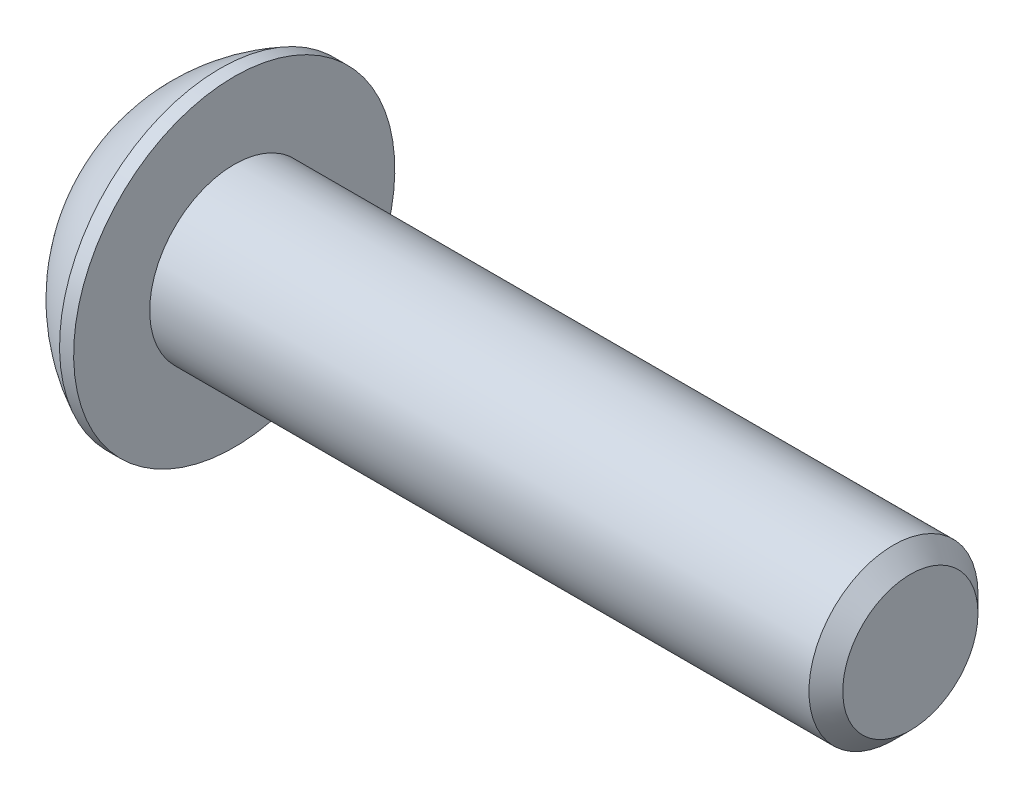
ISO-10303-21;
HEADER;
FILE_DESCRIPTION(('STEP AP214'),'2;1');
FILE_NAME('part.step','',(''),(''),'','','');
FILE_SCHEMA(('AUTOMOTIVE_DESIGN { 1 0 10303 214 1 1 1 1 }'));
ENDSEC;
DATA;
#1=APPLICATION_CONTEXT('core data for automotive mechanical design processes');
#2=APPLICATION_PROTOCOL_DEFINITION('international standard','automotive_design',2000,#1);
#3=PRODUCT_CONTEXT('',#1,'mechanical');
#4=PRODUCT('Part','Part','',(#3));
#5=PRODUCT_RELATED_PRODUCT_CATEGORY('part','',(#4));
#6=PRODUCT_DEFINITION_FORMATION('','',#4);
#7=PRODUCT_DEFINITION_CONTEXT('part definition',#1,'design');
#8=PRODUCT_DEFINITION('design','',#6,#7);
#9=PRODUCT_DEFINITION_SHAPE('','',#8);
#10=(LENGTH_UNIT() NAMED_UNIT(*) SI_UNIT(.MILLI.,.METRE.));
#11=(NAMED_UNIT(*) PLANE_ANGLE_UNIT() SI_UNIT($,.RADIAN.));
#12=(NAMED_UNIT(*) SI_UNIT($,.STERADIAN.) SOLID_ANGLE_UNIT());
#13=UNCERTAINTY_MEASURE_WITH_UNIT(LENGTH_MEASURE(1.E-05),#10,'distance_accuracy_value','');
#14=(GEOMETRIC_REPRESENTATION_CONTEXT(3) GLOBAL_UNCERTAINTY_ASSIGNED_CONTEXT((#13)) GLOBAL_UNIT_ASSIGNED_CONTEXT((#10,
#11,#12)) REPRESENTATION_CONTEXT('',''));
#15=CARTESIAN_POINT('',(0.,0.,0.));
#16=DIRECTION('',(0.,0.,1.));
#17=DIRECTION('',(1.,0.,0.));
#18=AXIS2_PLACEMENT_3D('',#15,#16,#17);
#19=CARTESIAN_POINT('',(-12.,0.,0.));
#20=DIRECTION('',(1.,0.,0.));
#21=DIRECTION('',(0.,0.,-1.));
#22=AXIS2_PLACEMENT_3D('',#19,#20,#21);
#23=CYLINDRICAL_SURFACE('',#22,1.5);
#24=CARTESIAN_POINT('',(-0.300000000000002,0.,0.));
#25=DIRECTION('',(1.,0.,0.));
#26=DIRECTION('',(0.,0.,-1.));
#27=AXIS2_PLACEMENT_3D('',#24,#25,#26);
#28=CIRCLE('',#27,1.5);
#29=CARTESIAN_POINT('',(-0.300000000000002,0.,-1.5));
#30=VERTEX_POINT('',#29);
#31=EDGE_CURVE('E45',#30,#30,#28,.F.);
#32=ORIENTED_EDGE('',*,*,#31,.T.);
#33=EDGE_LOOP('',(#32));
#34=FACE_BOUND('',#33,.T.);
#35=CARTESIAN_POINT('',(-12.,0.,0.));
#36=DIRECTION('',(1.,0.,0.));
#37=DIRECTION('',(0.,1.,0.));
#38=AXIS2_PLACEMENT_3D('',#35,#36,#37);
#39=CIRCLE('',#38,1.5);
#40=CARTESIAN_POINT('',(-12.,1.49999999999999,0.));
#41=VERTEX_POINT('',#40);
#42=EDGE_CURVE('E124',#41,#41,#39,.F.);
#43=ORIENTED_EDGE('',*,*,#42,.F.);
#44=EDGE_LOOP('',(#43));
#45=FACE_BOUND('',#44,.T.);
#46=ADVANCED_FACE('F32',(#34,#45),#23,.T.);
#47=CARTESIAN_POINT('',(0.,0.,0.));
#48=DIRECTION('',(1.,0.,0.));
#49=DIRECTION('',(0.,0.,-1.));
#50=AXIS2_PLACEMENT_3D('',#47,#48,#49);
#51=PLANE('',#50);
#52=CARTESIAN_POINT('',(0.,0.,0.));
#53=DIRECTION('',(1.,0.,0.));
#54=DIRECTION('',(0.,0.,-1.));
#55=AXIS2_PLACEMENT_3D('',#52,#53,#54);
#56=CIRCLE('',#55,1.2);
#57=CARTESIAN_POINT('',(0.,0.,-1.2));
#58=VERTEX_POINT('',#57);
#59=EDGE_CURVE('E127',#58,#58,#56,.T.);
#60=ORIENTED_EDGE('',*,*,#59,.T.);
#61=EDGE_LOOP('',(#60));
#62=FACE_BOUND('',#61,.T.);
#63=ADVANCED_FACE('F137',(#62),#51,.T.);
#64=CARTESIAN_POINT('',(0.,0.,0.));
#65=DIRECTION('',(-1.,0.,0.));
#66=DIRECTION('',(0.,0.,1.));
#67=AXIS2_PLACEMENT_3D('',#64,#65,#66);
#68=CONICAL_SURFACE('',#67,1.2,0.785398163397447);
#69=ORIENTED_EDGE('',*,*,#31,.F.);
#70=EDGE_LOOP('',(#69));
#71=FACE_BOUND('',#70,.T.);
#72=ORIENTED_EDGE('',*,*,#59,.F.);
#73=EDGE_LOOP('',(#72));
#74=FACE_BOUND('',#73,.T.);
#75=ADVANCED_FACE('F34',(#71,#74),#68,.T.);
#76=CARTESIAN_POINT('',(-13.65,0.,0.));
#77=DIRECTION('',(-1.,0.,0.));
#78=DIRECTION('',(0.,-1.,0.));
#79=AXIS2_PLACEMENT_3D('',#76,#77,#78);
#80=PLANE('',#79);
#81=CARTESIAN_POINT('',(-13.65,0.,0.));
#82=DIRECTION('',(-1.,0.,0.));
#83=DIRECTION('',(0.,-1.,0.));
#84=AXIS2_PLACEMENT_3D('',#81,#82,#83);
#85=CIRCLE('',#84,1.20470053837925);
#86=CARTESIAN_POINT('',(-13.65,-1.20470053837926,0.));
#87=VERTEX_POINT('',#86);
#88=EDGE_CURVE('E241',#87,#87,#85,.T.);
#89=ORIENTED_EDGE('',*,*,#88,.F.);
#90=EDGE_LOOP('',(#89));
#91=FACE_BOUND('',#90,.T.);
#92=CARTESIAN_POINT('',(-13.65,0.,0.));
#93=DIRECTION('',(1.,0.,0.));
#94=DIRECTION('',(0.,1.,0.));
#95=AXIS2_PLACEMENT_3D('',#92,#93,#94);
#96=CIRCLE('',#95,1.5);
#97=CARTESIAN_POINT('',(-13.65,1.5,0.));
#98=VERTEX_POINT('',#97);
#99=EDGE_CURVE('E121',#98,#98,#96,.T.);
#100=ORIENTED_EDGE('',*,*,#99,.F.);
#101=EDGE_LOOP('',(#100));
#102=FACE_BOUND('',#101,.T.);
#103=ADVANCED_FACE('F136',(#91,#102),#80,.T.);
#104=CARTESIAN_POINT('',(-10.8526785714286,0.,0.));
#105=DIRECTION('',(1.,0.,0.));
#106=DIRECTION('',(0.,1.,0.));
#107=AXIS2_PLACEMENT_3D('',#104,#105,#106);
#108=SPHERICAL_SURFACE('',#107,3.17411517981703);
#109=CARTESIAN_POINT('',(-12.25,0.,0.));
#110=DIRECTION('',(1.,0.,0.));
#111=DIRECTION('',(0.,1.,0.));
#112=AXIS2_PLACEMENT_3D('',#109,#110,#111);
#113=CIRCLE('',#112,2.85);
#114=CARTESIAN_POINT('',(-12.25,2.85,0.));
#115=VERTEX_POINT('',#114);
#116=EDGE_CURVE('E118',#115,#115,#113,.T.);
#117=CARTESIAN_POINT('',(-13.65,1.5,0.));
#118=CARTESIAN_POINT('',(-13.6402697017537,1.51814590550861,0.));
#119=CARTESIAN_POINT('',(-13.6303627914101,1.53619710575443,0.));
#120=CARTESIAN_POINT('',(-13.6101996026695,1.57210331824231,0.));
#121=CARTESIAN_POINT('',(-13.5999433242725,1.58995833048438,0.));
#122=CARTESIAN_POINT('',(-13.5790852555662,1.62546538948657,0.));
#123=CARTESIAN_POINT('',(-13.5684834652569,1.64311743624671,0.));
#124=CARTESIAN_POINT('',(-13.5469383951658,1.67821188357876,0.));
#125=CARTESIAN_POINT('',(-13.535995115384,1.69565428415069,0.));
#126=CARTESIAN_POINT('',(-13.513771208612,1.73032283245974,0.));
#127=CARTESIAN_POINT('',(-13.5024905816219,1.74754898019686,0.));
#128=CARTESIAN_POINT('',(-13.4795962529979,1.78177849951501,0.));
#129=CARTESIAN_POINT('',(-13.467982551364,1.79878187109604,0.));
#130=CARTESIAN_POINT('',(-13.4444264714719,1.8325593987641,0.));
#131=CARTESIAN_POINT('',(-13.4324840932136,1.84933355485113,0.));
#132=CARTESIAN_POINT('',(-13.4082751827463,1.88264629910089,0.));
#133=CARTESIAN_POINT('',(-13.3960086505372,1.89918488726362,0.));
#134=CARTESIAN_POINT('',(-13.3711560775515,1.93202023241769,0.));
#135=CARTESIAN_POINT('',(-13.3585700367748,1.94831698940902,0.));
#136=CARTESIAN_POINT('',(-13.3330832130497,1.98066250056315,0.));
#137=CARTESIAN_POINT('',(-13.3201824301012,1.99671125472595,0.));
#138=CARTESIAN_POINT('',(-13.2940710076189,2.02855468248374,0.));
#139=CARTESIAN_POINT('',(-13.2808603680851,2.04434935607872,0.));
#140=CARTESIAN_POINT('',(-13.254134235364,2.07567864118366,0.));
#141=CARTESIAN_POINT('',(-13.2406187421766,2.09121325269361,0.));
#142=CARTESIAN_POINT('',(-13.2132880205292,2.12201653059784,0.));
#143=CARTESIAN_POINT('',(-13.1994727920692,2.13728519699211,0.));
#144=CARTESIAN_POINT('',(-13.1715478317686,2.16755080234906,0.));
#145=CARTESIAN_POINT('',(-13.157438099928,2.18254774131173,0.));
#146=CARTESIAN_POINT('',(-13.1289294762883,2.21226421239399,0.));
#147=CARTESIAN_POINT('',(-13.1145305844891,2.22698374451358,0.));
#148=CARTESIAN_POINT('',(-13.0854490938605,2.25613982755347,0.));
#149=CARTESIAN_POINT('',(-13.0707664950309,2.27057637847377,0.));
#150=CARTESIAN_POINT('',(-13.0411231507109,2.29916103192521,0.));
#151=CARTESIAN_POINT('',(-13.0261624052204,2.31330913445635,0.));
#152=CARTESIAN_POINT('',(-12.9959684332833,2.34131153317633,0.));
#153=CARTESIAN_POINT('',(-12.9807352068367,2.35516582936518,0.));
#154=CARTESIAN_POINT('',(-12.9500020418819,2.38257536871332,0.));
#155=CARTESIAN_POINT('',(-12.9345021033738,2.3961306118726,0.));
#156=CARTESIAN_POINT('',(-12.9032413841958,2.42293691172714,0.));
#157=CARTESIAN_POINT('',(-12.887480603526,2.43618796842238,0.));
#158=CARTESIAN_POINT('',(-12.8557041687066,2.46238087711119,0.));
#159=CARTESIAN_POINT('',(-12.839688514557,2.47532272910475,0.));
#160=CARTESIAN_POINT('',(-12.8074083979817,2.50089232724988,0.));
#161=CARTESIAN_POINT('',(-12.7911439355561,2.51352007340145,0.));
#162=CARTESIAN_POINT('',(-12.7583723618573,2.53845667767541,0.));
#163=CARTESIAN_POINT('',(-12.7418652505841,2.55076553579779,0.));
#164=CARTESIAN_POINT('',(-12.7086146305115,2.57505970259155,0.));
#165=CARTESIAN_POINT('',(-12.691871121712,2.58704501126291,0.));
#166=CARTESIAN_POINT('',(-12.658154047431,2.61068754025891,0.));
#167=CARTESIAN_POINT('',(-12.6411804819494,2.62234476058354,0.));
#168=CARTESIAN_POINT('',(-12.607009722279,2.64532669825233,0.));
#169=CARTESIAN_POINT('',(-12.5898125280901,2.65665141559648,0.));
#170=CARTESIAN_POINT('',(-12.5552010236432,2.6789640585411,0.));
#171=CARTESIAN_POINT('',(-12.5377867133852,2.68995198414157,0.));
#172=CARTESIAN_POINT('',(-12.5027475717571,2.71158688256655,0.));
#173=CARTESIAN_POINT('',(-12.485122740387,2.72223385539107,0.));
#174=CARTESIAN_POINT('',(-12.449669230859,2.74318281565687,0.));
#175=CARTESIAN_POINT('',(-12.4318405527012,2.75348480309814,0.));
#176=CARTESIAN_POINT('',(-12.395986102456,2.7737398932333,0.));
#177=CARTESIAN_POINT('',(-12.3779603303685,2.78369299592719,0.));
#178=CARTESIAN_POINT('',(-12.3417185147769,2.8032465396409,0.));
#179=CARTESIAN_POINT('',(-12.3235024712727,2.81284698066071,0.));
#180=CARTESIAN_POINT('',(-12.2868870260232,2.83169159380608,0.));
#181=CARTESIAN_POINT('',(-12.268487624278,2.84093576593165,0.));
#182=CARTESIAN_POINT('',(-12.25,2.85,0.));
#183=B_SPLINE_CURVE_WITH_KNOTS('',3,(#117,#118,#119,#120,#121,#122,#123,#124,#125,#126,#127,
#128,#129,#130,#131,#132,#133,#134,#135,#136,#137,#138,#139,#140,#141,#142,#143,#144,#145,#146,
#147,#148,#149,#150,#151,#152,#153,#154,#155,#156,#157,#158,#159,#160,#161,#162,#163,#164,#165,
#166,#167,#168,#169,#170,#171,#172,#173,#174,#175,#176,#177,#178,#179,#180,#181,#182),
.UNSPECIFIED.,.F.,.F.,(4,2,2,2,2,2,2,2,2,2,2,2,2,2,2,2,2,2,2,2,2,2,2,2,2,2,2,2,2,2,2,2,4),(0.,
0.0617693508858092,0.123538701771618,0.185308052657428,0.247077403543237,0.308846754429047,
0.370616105314856,0.432385456200665,0.494154807086475,0.555924157972284,0.617693508858094,
0.679462859743903,0.741232210629711,0.803001561515521,0.864770912401331,0.92654026328714,
0.98830961417295,1.05007896505876,1.11184831594457,1.17361766683038,1.23538701771619,
1.29715636860199,1.35892571948781,1.42069507037361,1.48246442125942,1.54423377214523,
1.60600312303104,1.66777247391685,1.72954182480266,1.79131117568847,1.85308052657428,
1.91484987746009,1.9766192283459),.UNSPECIFIED.);
#184=EDGE_CURVE('BSEAM148',#98,#115,#183,.T.);
#185=ORIENTED_EDGE('',*,*,#99,.T.);
#186=ORIENTED_EDGE('',*,*,#116,.F.);
#187=ORIENTED_EDGE('',*,*,#184,.T.);
#188=ORIENTED_EDGE('',*,*,#184,.F.);
#189=EDGE_LOOP('',(#185,#187,#186,#188));
#190=FACE_BOUND('',#189,.T.);
#191=ADVANCED_FACE('F148',(#190),#108,.T.);
#192=CARTESIAN_POINT('',(-12.,0.,0.));
#193=DIRECTION('',(1.,0.,0.));
#194=DIRECTION('',(0.,1.,0.));
#195=AXIS2_PLACEMENT_3D('',#192,#193,#194);
#196=CYLINDRICAL_SURFACE('',#195,2.85);
#197=ORIENTED_EDGE('',*,*,#116,.T.);
#198=EDGE_LOOP('',(#197));
#199=FACE_BOUND('',#198,.T.);
#200=CARTESIAN_POINT('',(-12.,0.,0.));
#201=DIRECTION('',(1.,0.,0.));
#202=DIRECTION('',(0.,1.,0.));
#203=AXIS2_PLACEMENT_3D('',#200,#201,#202);
#204=CIRCLE('',#203,2.85);
#205=CARTESIAN_POINT('',(-12.,2.85,0.));
#206=VERTEX_POINT('',#205);
#207=EDGE_CURVE('E115',#206,#206,#204,.T.);
#208=ORIENTED_EDGE('',*,*,#207,.F.);
#209=EDGE_LOOP('',(#208));
#210=FACE_BOUND('',#209,.T.);
#211=ADVANCED_FACE('F152',(#199,#210),#196,.T.);
#212=CARTESIAN_POINT('',(-12.,2.85,0.));
#213=DIRECTION('',(1.,0.,0.));
#214=DIRECTION('',(0.,1.,0.));
#215=AXIS2_PLACEMENT_3D('',#212,#213,#214);
#216=PLANE('',#215);
#217=ORIENTED_EDGE('',*,*,#42,.T.);
#218=EDGE_LOOP('',(#217));
#219=FACE_BOUND('',#218,.T.);
#220=ORIENTED_EDGE('',*,*,#207,.T.);
#221=EDGE_LOOP('',(#220));
#222=FACE_BOUND('',#221,.T.);
#223=ADVANCED_FACE('F156',(#219,#222),#216,.T.);
#224=CARTESIAN_POINT('',(-13.65,0.,0.));
#225=DIRECTION('',(-1.,0.,0.));
#226=DIRECTION('',(0.,-1.,0.));
#227=AXIS2_PLACEMENT_3D('',#224,#225,#226);
#228=CONICAL_SURFACE('',#227,1.20470053837925,0.78539816339745);
#229=ORIENTED_EDGE('',*,*,#88,.T.);
#230=EDGE_LOOP('',(#229));
#231=FACE_BOUND('',#230,.T.);
#232=CARTESIAN_POINT('',(-14.0125645579163,-1.20678079288097,1.));
#233=CARTESIAN_POINT('',(-13.9901238799752,-1.17763239380938,1.));
#234=CARTESIAN_POINT('',(-13.9678867609271,-1.14832777655039,1.));
#235=CARTESIAN_POINT('',(-13.9239053230859,-1.08934073997341,1.));
#236=CARTESIAN_POINT('',(-13.902161120887,-1.05965823380996,1.));
#237=CARTESIAN_POINT('',(-13.8374858802222,-0.969511619364386,1.));
#238=CARTESIAN_POINT('',(-13.795456442765,-0.908390032886416,1.));
#239=CARTESIAN_POINT('',(-13.7124203349119,-0.77984989921404,1.));
#240=CARTESIAN_POINT('',(-13.6716484956871,-0.712278047733967,1.));
#241=CARTESIAN_POINT('',(-13.5967056855402,-0.573692441836185,1.));
#242=CARTESIAN_POINT('',(-13.5625124208036,-0.502691370033597,1.));
#243=CARTESIAN_POINT('',(-13.5206648240494,-0.396633108483675,1.));
#244=CARTESIAN_POINT('',(-13.5087524246011,-0.363265114723103,1.));
#245=CARTESIAN_POINT('',(-13.4876010580815,-0.295675144863699,1.));
#246=CARTESIAN_POINT('',(-13.4783622608543,-0.261453114661039,1.));
#247=CARTESIAN_POINT('',(-13.4632108375931,-0.192964714439433,1.));
#248=CARTESIAN_POINT('',(-13.4572372079353,-0.158712062702438,1.));
#249=CARTESIAN_POINT('',(-13.4487381792859,-0.0897678989597951,1.));
#250=CARTESIAN_POINT('',(-13.4462131691607,-0.0550763379077967,1.));
#251=CARTESIAN_POINT('',(-13.4448308242394,0.0128534343371955,1.));
#252=CARTESIAN_POINT('',(-13.4458171333425,0.0460884918414608,1.));
#253=CARTESIAN_POINT('',(-13.4510428296463,0.112288777523348,1.));
#254=CARTESIAN_POINT('',(-13.4552814228284,0.145254069576921,1.));
#255=CARTESIAN_POINT('',(-13.4668431932388,0.211252641710467,1.));
#256=CARTESIAN_POINT('',(-13.4742213991969,0.24427612610641,1.));
#257=CARTESIAN_POINT('',(-13.4916537633013,0.3095934161789,1.));
#258=CARTESIAN_POINT('',(-13.5017077720937,0.34188726247213,1.));
#259=CARTESIAN_POINT('',(-13.5364692676108,0.441188556116708,1.));
#260=CARTESIAN_POINT('',(-13.5650343603337,0.50684148084348,1.));
#261=CARTESIAN_POINT('',(-13.6286033694253,0.635081389212367,1.));
#262=CARTESIAN_POINT('',(-13.663629955309,0.697656564069526,1.));
#263=CARTESIAN_POINT('',(-13.7359546107891,0.817274369694615,1.));
#264=CARTESIAN_POINT('',(-13.7730556162911,0.874437672313584,1.));
#265=CARTESIAN_POINT('',(-13.8304371678966,0.958655710303487,1.));
#266=CARTESIAN_POINT('',(-13.8497720189249,0.986366163766953,1.));
#267=CARTESIAN_POINT('',(-13.8889602713879,1.04140691974409,1.));
#268=CARTESIAN_POINT('',(-13.908813529201,1.06873732439881,1.));
#269=CARTESIAN_POINT('',(-13.92888195229,1.0959092145887,1.));
#270=B_SPLINE_CURVE_WITH_KNOTS('',3,(#232,#233,#234,#235,#236,#237,#238,#239,#240,#241,#242,
#243,#244,#245,#246,#247,#248,#249,#250,#251,#252,#253,#254,#255,#256,#257,#258,#259,#260,#261,
#262,#263,#264,#265,#266,#267,#268,#269),.UNSPECIFIED.,.F.,.F.,(4,2,2,2,2,2,2,2,2,2,2,2,2,2,2,2,
2,2,4),(0.,0.110355487284534,0.220736811203826,0.443178348562911,0.679759335181117,
0.915523888816462,1.02172703810024,1.1279369325962,1.23208803653002,1.33625088357217,
1.43583459192535,1.53539399546241,1.63677534642524,1.73815103982916,1.95232008261278,
2.16725532249797,2.37159620059983,2.47295962852456,2.57429526618464),.UNSPECIFIED.);
#271=CARTESIAN_POINT('',(-13.6,-0.577350269189637,1.));
#272=VERTEX_POINT('',#271);
#273=CARTESIAN_POINT('',(-13.6,0.577350269189616,1.));
#274=VERTEX_POINT('',#273);
#275=EDGE_CURVE('E99',#272,#274,#270,.T.);
#276=ORIENTED_EDGE('',*,*,#275,.F.);
#277=CARTESIAN_POINT('',(-13.6001154873726,-1.1548160084331,-0.000200000000000086));
#278=CARTESIAN_POINT('',(-13.5802779308257,-1.13496520795027,0.0341825950071807));
#279=CARTESIAN_POINT('',(-13.5616050206389,-1.11478247255943,0.0691401181398248));
#280=CARTESIAN_POINT('',(-13.5274147427232,-1.0736273952922,0.140422802956089));
#281=CARTESIAN_POINT('',(-13.5119164090235,-1.05265113558081,0.176754750528984));
#282=CARTESIAN_POINT('',(-13.4853673071423,-1.01035337909804,0.250016613803311));
#283=CARTESIAN_POINT('',(-13.4742497739969,-0.989042666109251,0.286927851445414));
#284=CARTESIAN_POINT('',(-13.4571198657762,-0.945952199282702,0.361562729310858));
#285=CARTESIAN_POINT('',(-13.4510946974667,-0.924173762626608,0.399284088108635));
#286=CARTESIAN_POINT('',(-13.4456605549675,-0.886641312640026,0.464292198417932));
#287=CARTESIAN_POINT('',(-13.4448569383167,-0.870936130672287,0.491494371528171));
#288=CARTESIAN_POINT('',(-13.4462066994169,-0.83955617986286,0.545846040669111));
#289=CARTESIAN_POINT('',(-13.4483607295472,-0.823881418494935,0.572995523754874));
#290=CARTESIAN_POINT('',(-13.4591169721285,-0.777080970599378,0.654056277326959));
#291=CARTESIAN_POINT('',(-13.4720145564154,-0.746188191116442,0.707564140978426));
#292=CARTESIAN_POINT('',(-13.5031407306022,-0.691968116419661,0.80147606514343));
#293=CARTESIAN_POINT('',(-13.5197377977018,-0.668386557293383,0.842320523671833));
#294=CARTESIAN_POINT('',(-13.5571249246853,-0.622147085933693,0.922409637381943));
#295=CARTESIAN_POINT('',(-13.5779013418174,-0.599486449584586,0.961659010870437));
#296=CARTESIAN_POINT('',(-13.6001154873726,-0.577234799135799,1.0002));
#297=B_SPLINE_CURVE_WITH_KNOTS('',3,(#277,#278,#279,#280,#281,#282,#283,#284,#285,#286,#287,
#288,#289,#290,#291,#292,#293,#294,#295,#296),.UNSPECIFIED.,.F.,.F.,(4,2,2,2,2,2,2,2,2,4),(0.,
0.133237676828559,0.26725222983449,0.3991370762693,0.530689603280767,0.624814864263845,
0.718960890149131,0.907306626112096,1.05710100361789,1.20641411519286),.UNSPECIFIED.);
#298=CARTESIAN_POINT('',(-13.6,-1.15470053837926,0.));
#299=VERTEX_POINT('',#298);
#300=EDGE_CURVE('E198',#299,#272,#297,.T.);
#301=ORIENTED_EDGE('',*,*,#300,.F.);
#302=CARTESIAN_POINT('',(-13.6001154873726,-0.577234799135799,-1.0002));
#303=CARTESIAN_POINT('',(-13.5802779308257,-0.597085599618632,-0.965817404992819));
#304=CARTESIAN_POINT('',(-13.5616050206389,-0.617268335009467,-0.930859881860175));
#305=CARTESIAN_POINT('',(-13.5274147427232,-0.658423412276697,-0.85957719704391));
#306=CARTESIAN_POINT('',(-13.5119164090235,-0.679399671988091,-0.823245249471016));
#307=CARTESIAN_POINT('',(-13.4853673071423,-0.721697428470857,-0.749983386196689));
#308=CARTESIAN_POINT('',(-13.4742497739969,-0.743008141459647,-0.713072148554586));
#309=CARTESIAN_POINT('',(-13.4571198657762,-0.786098608286197,-0.638437270689141));
#310=CARTESIAN_POINT('',(-13.4510946974667,-0.807877044942291,-0.600715911891365));
#311=CARTESIAN_POINT('',(-13.4456605549675,-0.845409494928873,-0.535707801582067));
#312=CARTESIAN_POINT('',(-13.4448569383167,-0.861114676896612,-0.508505628471829));
#313=CARTESIAN_POINT('',(-13.4462066994169,-0.892494627706039,-0.454153959330889));
#314=CARTESIAN_POINT('',(-13.4483607295472,-0.908169389073964,-0.427004476245125));
#315=CARTESIAN_POINT('',(-13.4591169721285,-0.954969836969521,-0.345943722673041));
#316=CARTESIAN_POINT('',(-13.4720145564154,-0.985862616452458,-0.292435859021573));
#317=CARTESIAN_POINT('',(-13.5031407306022,-1.04008269114924,-0.198523934856569));
#318=CARTESIAN_POINT('',(-13.5197377977018,-1.06366425027552,-0.157679476328167));
#319=CARTESIAN_POINT('',(-13.5571249246853,-1.10990372163521,-0.0775903626180571));
#320=CARTESIAN_POINT('',(-13.5779013418174,-1.13256435798431,-0.0383409891295628));
#321=CARTESIAN_POINT('',(-13.6001154873726,-1.1548160084331,0.00019999999999995));
#322=B_SPLINE_CURVE_WITH_KNOTS('',3,(#302,#303,#304,#305,#306,#307,#308,#309,#310,#311,#312,
#313,#314,#315,#316,#317,#318,#319,#320,#321),.UNSPECIFIED.,.F.,.F.,(4,2,2,2,2,2,2,2,2,4),(0.,
0.133237676828559,0.26725222983449,0.3991370762693,0.530689603280767,0.624814864263845,
0.718960890149132,0.907306626112096,1.05710100361789,1.20641411519286),.UNSPECIFIED.);
#323=CARTESIAN_POINT('',(-13.6,-0.577350269189637,-1.));
#324=VERTEX_POINT('',#323);
#325=EDGE_CURVE('E193',#324,#299,#322,.T.);
#326=ORIENTED_EDGE('',*,*,#325,.F.);
#327=CARTESIAN_POINT('',(-14.0125645579163,-1.20678079288097,-1.));
#328=CARTESIAN_POINT('',(-13.9901238799752,-1.17763239380938,-1.));
#329=CARTESIAN_POINT('',(-13.9678867609271,-1.14832777655039,-1.));
#330=CARTESIAN_POINT('',(-13.9239053230859,-1.08934073997341,-1.));
#331=CARTESIAN_POINT('',(-13.902161120887,-1.05965823380996,-1.));
#332=CARTESIAN_POINT('',(-13.8374858802222,-0.969511619364386,-1.));
#333=CARTESIAN_POINT('',(-13.795456442765,-0.908390032886415,-1.));
#334=CARTESIAN_POINT('',(-13.7124203349119,-0.77984989921404,-1.));
#335=CARTESIAN_POINT('',(-13.6716484956871,-0.712278047733968,-1.));
#336=CARTESIAN_POINT('',(-13.5967056855402,-0.573692441836185,-1.));
#337=CARTESIAN_POINT('',(-13.5625124208036,-0.502691370033597,-1.));
#338=CARTESIAN_POINT('',(-13.5206648240494,-0.396633108483675,-1.));
#339=CARTESIAN_POINT('',(-13.5087524246011,-0.363265114723103,-1.));
#340=CARTESIAN_POINT('',(-13.4876010580815,-0.2956751448637,-1.));
#341=CARTESIAN_POINT('',(-13.4783622608543,-0.261453114661039,-1.));
#342=CARTESIAN_POINT('',(-13.4632108375931,-0.192964714439433,-1.));
#343=CARTESIAN_POINT('',(-13.4572372079353,-0.158712062702438,-1.));
#344=CARTESIAN_POINT('',(-13.4487381792859,-0.0897678989597955,-1.));
#345=CARTESIAN_POINT('',(-13.4462131691607,-0.0550763379077972,-1.));
#346=CARTESIAN_POINT('',(-13.4448308242394,0.012853434337195,-1.));
#347=CARTESIAN_POINT('',(-13.4458171333425,0.0460884918414604,-1.));
#348=CARTESIAN_POINT('',(-13.4510428296463,0.112288777523348,-1.));
#349=CARTESIAN_POINT('',(-13.4552814228284,0.145254069576921,-1.));
#350=CARTESIAN_POINT('',(-13.4668431932388,0.211252641710467,-1.));
#351=CARTESIAN_POINT('',(-13.4742213991969,0.244276126106411,-1.));
#352=CARTESIAN_POINT('',(-13.4916537633013,0.3095934161789,-1.));
#353=CARTESIAN_POINT('',(-13.5017077720937,0.34188726247213,-1.));
#354=CARTESIAN_POINT('',(-13.5364692676108,0.441188556116708,-1.));
#355=CARTESIAN_POINT('',(-13.5650343603337,0.50684148084348,-1.));
#356=CARTESIAN_POINT('',(-13.6286033694253,0.635081389212366,-1.));
#357=CARTESIAN_POINT('',(-13.663629955309,0.697656564069526,-1.));
#358=CARTESIAN_POINT('',(-13.7359546107891,0.817274369694615,-1.));
#359=CARTESIAN_POINT('',(-13.7730556162911,0.874437672313584,-1.));
#360=CARTESIAN_POINT('',(-13.8304371678966,0.958655710303487,-1.));
#361=CARTESIAN_POINT('',(-13.8497720189249,0.986366163766954,-1.));
#362=CARTESIAN_POINT('',(-13.8889602713879,1.04140691974409,-1.));
#363=CARTESIAN_POINT('',(-13.908813529201,1.06873732439881,-1.));
#364=CARTESIAN_POINT('',(-13.92888195229,1.0959092145887,-1.));
#365=B_SPLINE_CURVE_WITH_KNOTS('',3,(#327,#328,#329,#330,#331,#332,#333,#334,#335,#336,#337,
#338,#339,#340,#341,#342,#343,#344,#345,#346,#347,#348,#349,#350,#351,#352,#353,#354,#355,#356,
#357,#358,#359,#360,#361,#362,#363,#364),.UNSPECIFIED.,.F.,.F.,(4,2,2,2,2,2,2,2,2,2,2,2,2,2,2,2,
2,2,4),(0.,0.110355487284534,0.220736811203825,0.443178348562911,0.679759335181115,
0.915523888816463,1.02172703810024,1.1279369325962,1.23208803653002,1.33625088357217,
1.43583459192535,1.53539399546241,1.63677534642524,1.73815103982916,1.95232008261278,
2.16725532249797,2.37159620059983,2.47295962852456,2.57429526618464),.UNSPECIFIED.);
#366=CARTESIAN_POINT('',(-13.6,0.577350269189616,-1.));
#367=VERTEX_POINT('',#366);
#368=EDGE_CURVE('E52',#367,#324,#365,.F.);
#369=ORIENTED_EDGE('',*,*,#368,.F.);
#370=CARTESIAN_POINT('',(-13.6001154873726,1.15481600843308,0.000199999999999967));
#371=CARTESIAN_POINT('',(-13.5802779308257,1.13496520795025,-0.0341825950071809));
#372=CARTESIAN_POINT('',(-13.5616050206389,1.11478247255941,-0.0691401181398252));
#373=CARTESIAN_POINT('',(-13.5274147427232,1.07362739529218,-0.14042280295609));
#374=CARTESIAN_POINT('',(-13.5119164090235,1.05265113558079,-0.176754750528985));
#375=CARTESIAN_POINT('',(-13.4853673071423,1.01035337909802,-0.250016613803312));
#376=CARTESIAN_POINT('',(-13.4742497739969,0.98904266610923,-0.286927851445416));
#377=CARTESIAN_POINT('',(-13.4571198657762,0.94595219928268,-0.361562729310861));
#378=CARTESIAN_POINT('',(-13.4510946974667,0.924173762626585,-0.399284088108638));
#379=CARTESIAN_POINT('',(-13.4456605549675,0.886641312640003,-0.464292198417936));
#380=CARTESIAN_POINT('',(-13.4448569383167,0.870936130672264,-0.491494371528174));
#381=CARTESIAN_POINT('',(-13.4462066994169,0.839556179862837,-0.545846040669114));
#382=CARTESIAN_POINT('',(-13.4483607295472,0.823881418494912,-0.572995523754878));
#383=CARTESIAN_POINT('',(-13.4591169721285,0.777080970599355,-0.654056277326962));
#384=CARTESIAN_POINT('',(-13.4720145564154,0.746188191116419,-0.70756414097843));
#385=CARTESIAN_POINT('',(-13.5031407306022,0.691968116419638,-0.801476065143433));
#386=CARTESIAN_POINT('',(-13.5197377977018,0.66838655729336,-0.842320523671836));
#387=CARTESIAN_POINT('',(-13.5571249246853,0.622147085933671,-0.922409637381944));
#388=CARTESIAN_POINT('',(-13.5779013418174,0.599486449584565,-0.961659010870438));
#389=CARTESIAN_POINT('',(-13.6001154873726,0.577234799135778,-1.0002));
#390=B_SPLINE_CURVE_WITH_KNOTS('',3,(#370,#371,#372,#373,#374,#375,#376,#377,#378,#379,#380,
#381,#382,#383,#384,#385,#386,#387,#388,#389),.UNSPECIFIED.,.F.,.F.,(4,2,2,2,2,2,2,2,2,4),(0.,
0.133237676828559,0.267252229834491,0.399137076269301,0.53068960328077,0.624814864263848,
0.718960890149135,0.9073066261121,1.05710100361789,1.20641411519286),.UNSPECIFIED.);
#391=CARTESIAN_POINT('',(-13.6,1.15470053837924,0.));
#392=VERTEX_POINT('',#391);
#393=EDGE_CURVE('E11',#392,#367,#390,.T.);
#394=ORIENTED_EDGE('',*,*,#393,.F.);
#395=CARTESIAN_POINT('',(-13.6001154873726,0.577234799135778,1.0002));
#396=CARTESIAN_POINT('',(-13.5802779308257,0.597085599618611,0.965817404992819));
#397=CARTESIAN_POINT('',(-13.5616050206389,0.617268335009446,0.930859881860175));
#398=CARTESIAN_POINT('',(-13.5274147427232,0.658423412276675,0.859577197043911));
#399=CARTESIAN_POINT('',(-13.5119164090235,0.679399671988069,0.823245249471017));
#400=CARTESIAN_POINT('',(-13.4853673071423,0.721697428470835,0.74998338619669));
#401=CARTESIAN_POINT('',(-13.4742497739969,0.743008141459626,0.713072148554587));
#402=CARTESIAN_POINT('',(-13.4571198657762,0.786098608286175,0.638437270689142));
#403=CARTESIAN_POINT('',(-13.4510946974667,0.80787704494227,0.600715911891365));
#404=CARTESIAN_POINT('',(-13.4456605549675,0.845409494928852,0.535707801582068));
#405=CARTESIAN_POINT('',(-13.4448569383167,0.861114676896591,0.508505628471829));
#406=CARTESIAN_POINT('',(-13.4462066994169,0.892494627706018,0.454153959330889));
#407=CARTESIAN_POINT('',(-13.4483607295472,0.908169389073943,0.427004476245126));
#408=CARTESIAN_POINT('',(-13.4591169721285,0.9549698369695,0.345943722673041));
#409=CARTESIAN_POINT('',(-13.4720145564154,0.985862616452436,0.292435859021574));
#410=CARTESIAN_POINT('',(-13.5031407306022,1.04008269114922,0.19852393485657));
#411=CARTESIAN_POINT('',(-13.5197377977018,1.06366425027549,0.157679476328167));
#412=CARTESIAN_POINT('',(-13.5571249246853,1.10990372163519,0.0775903626180574));
#413=CARTESIAN_POINT('',(-13.5779013418174,1.13256435798429,0.0383409891295631));
#414=CARTESIAN_POINT('',(-13.6001154873726,1.15481600843308,-0.000199999999999691));
#415=B_SPLINE_CURVE_WITH_KNOTS('',3,(#395,#396,#397,#398,#399,#400,#401,#402,#403,#404,#405,
#406,#407,#408,#409,#410,#411,#412,#413,#414),.UNSPECIFIED.,.F.,.F.,(4,2,2,2,2,2,2,2,2,4),(0.,
0.133237676828558,0.267252229834489,0.399137076269298,0.530689603280766,0.624814864263844,
0.718960890149131,0.907306626112095,1.05710100361789,1.20641411519286),.UNSPECIFIED.);
#416=EDGE_CURVE('E90',#274,#392,#415,.T.);
#417=ORIENTED_EDGE('',*,*,#416,.F.);
#418=EDGE_LOOP('',(#276,#301,#326,#369,#394,#417));
#419=FACE_BOUND('',#418,.T.);
#420=ADVANCED_FACE('F89',(#231,#419),#228,.F.);
#421=CARTESIAN_POINT('',(-12.45,0.,0.));
#422=DIRECTION('',(-1.,0.,0.));
#423=DIRECTION('',(0.,0.,1.));
#424=AXIS2_PLACEMENT_3D('',#421,#422,#423);
#425=PLANE('',#424);
#426=DIRECTION('',(0.,0.5,-0.866025403784439));
#427=VECTOR('',#426,1.);
#428=CARTESIAN_POINT('',(-12.45,0.577350269189616,1.));
#429=LINE('',#428,#427);
#430=CARTESIAN_POINT('',(-12.45,0.577350269189616,1.));
#431=VERTEX_POINT('',#430);
#432=CARTESIAN_POINT('',(-12.45,1.15470053837924,0.));
#433=VERTEX_POINT('',#432);
#434=EDGE_CURVE('E98',#431,#433,#429,.T.);
#435=ORIENTED_EDGE('',*,*,#434,.T.);
#436=DIRECTION('',(0.,-0.5,-0.866025403784439));
#437=VECTOR('',#436,1.);
#438=CARTESIAN_POINT('',(-12.45,1.15470053837924,0.));
#439=LINE('',#438,#437);
#440=CARTESIAN_POINT('',(-12.45,0.577350269189615,-1.));
#441=VERTEX_POINT('',#440);
#442=EDGE_CURVE('E103',#433,#441,#439,.T.);
#443=ORIENTED_EDGE('',*,*,#442,.T.);
#444=DIRECTION('',(0.,-1.,0.));
#445=VECTOR('',#444,1.);
#446=CARTESIAN_POINT('',(-12.45,0.577350269189615,-1.));
#447=LINE('',#446,#445);
#448=CARTESIAN_POINT('',(-12.45,-0.577350269189637,-1.));
#449=VERTEX_POINT('',#448);
#450=EDGE_CURVE('E223',#441,#449,#447,.T.);
#451=ORIENTED_EDGE('',*,*,#450,.T.);
#452=DIRECTION('',(0.,-0.5,0.866025403784439));
#453=VECTOR('',#452,1.);
#454=CARTESIAN_POINT('',(-12.45,-0.577350269189637,-1.));
#455=LINE('',#454,#453);
#456=CARTESIAN_POINT('',(-12.45,-1.15470053837926,0.));
#457=VERTEX_POINT('',#456);
#458=EDGE_CURVE('E227',#449,#457,#455,.T.);
#459=ORIENTED_EDGE('',*,*,#458,.T.);
#460=DIRECTION('',(0.,0.5,0.866025403784439));
#461=VECTOR('',#460,1.);
#462=CARTESIAN_POINT('',(-12.45,-1.15470053837926,0.));
#463=LINE('',#462,#461);
#464=CARTESIAN_POINT('',(-12.45,-0.577350269189637,1.));
#465=VERTEX_POINT('',#464);
#466=EDGE_CURVE('E111',#457,#465,#463,.T.);
#467=ORIENTED_EDGE('',*,*,#466,.T.);
#468=DIRECTION('',(0.,1.,0.));
#469=VECTOR('',#468,1.);
#470=CARTESIAN_POINT('',(-12.45,-0.577350269189637,1.));
#471=LINE('',#470,#469);
#472=EDGE_CURVE('E106',#465,#431,#471,.T.);
#473=ORIENTED_EDGE('',*,*,#472,.T.);
#474=EDGE_LOOP('',(#435,#443,#451,#459,#467,#473));
#475=FACE_BOUND('',#474,.T.);
#476=ADVANCED_FACE('F180',(#475),#425,.T.);
#477=CARTESIAN_POINT('',(-12.45,1.15470053837924,0.));
#478=DIRECTION('',(0.,0.866025403784439,-0.5));
#479=DIRECTION('',(0.,0.5,0.866025403784439));
#480=AXIS2_PLACEMENT_3D('',#477,#478,#479);
#481=PLANE('',#480);
#482=DIRECTION('',(-1.,0.,0.));
#483=VECTOR('',#482,1.);
#484=CARTESIAN_POINT('',(-12.45,1.15470053837924,0.));
#485=LINE('',#484,#483);
#486=EDGE_CURVE('E96',#433,#392,#485,.T.);
#487=ORIENTED_EDGE('',*,*,#486,.T.);
#488=ORIENTED_EDGE('',*,*,#393,.T.);
#489=DIRECTION('',(-1.,0.,0.));
#490=VECTOR('',#489,1.);
#491=CARTESIAN_POINT('',(-12.45,0.577350269189615,-1.));
#492=LINE('',#491,#490);
#493=EDGE_CURVE('E105',#441,#367,#492,.T.);
#494=ORIENTED_EDGE('',*,*,#493,.F.);
#495=ORIENTED_EDGE('',*,*,#442,.F.);
#496=EDGE_LOOP('',(#487,#488,#494,#495));
#497=FACE_BOUND('',#496,.T.);
#498=ADVANCED_FACE('F101',(#497),#481,.F.);
#499=CARTESIAN_POINT('',(-12.45,0.577350269189615,-1.));
#500=DIRECTION('',(0.,0.,-1.));
#501=DIRECTION('',(-1.,0.,0.));
#502=AXIS2_PLACEMENT_3D('',#499,#500,#501);
#503=PLANE('',#502);
#504=ORIENTED_EDGE('',*,*,#493,.T.);
#505=ORIENTED_EDGE('',*,*,#368,.T.);
#506=DIRECTION('',(-1.,0.,0.));
#507=VECTOR('',#506,1.);
#508=CARTESIAN_POINT('',(-12.45,-0.577350269189637,-1.));
#509=LINE('',#508,#507);
#510=EDGE_CURVE('E108',#449,#324,#509,.T.);
#511=ORIENTED_EDGE('',*,*,#510,.F.);
#512=ORIENTED_EDGE('',*,*,#450,.F.);
#513=EDGE_LOOP('',(#504,#505,#511,#512));
#514=FACE_BOUND('',#513,.T.);
#515=ADVANCED_FACE('F212',(#514),#503,.F.);
#516=CARTESIAN_POINT('',(-12.45,-0.577350269189637,-1.));
#517=DIRECTION('',(0.,-0.866025403784439,-0.5));
#518=DIRECTION('',(0.,0.5,-0.866025403784439));
#519=AXIS2_PLACEMENT_3D('',#516,#517,#518);
#520=PLANE('',#519);
#521=ORIENTED_EDGE('',*,*,#510,.T.);
#522=ORIENTED_EDGE('',*,*,#325,.T.);
#523=DIRECTION('',(-1.,0.,0.));
#524=VECTOR('',#523,1.);
#525=CARTESIAN_POINT('',(-12.45,-1.15470053837926,0.));
#526=LINE('',#525,#524);
#527=EDGE_CURVE('E237',#457,#299,#526,.T.);
#528=ORIENTED_EDGE('',*,*,#527,.F.);
#529=ORIENTED_EDGE('',*,*,#458,.F.);
#530=EDGE_LOOP('',(#521,#522,#528,#529));
#531=FACE_BOUND('',#530,.T.);
#532=ADVANCED_FACE('F207',(#531),#520,.F.);
#533=CARTESIAN_POINT('',(-12.45,-1.15470053837926,0.));
#534=DIRECTION('',(0.,-0.866025403784439,0.5));
#535=DIRECTION('',(0.,-0.5,-0.866025403784439));
#536=AXIS2_PLACEMENT_3D('',#533,#534,#535);
#537=PLANE('',#536);
#538=ORIENTED_EDGE('',*,*,#527,.T.);
#539=ORIENTED_EDGE('',*,*,#300,.T.);
#540=DIRECTION('',(-1.,0.,0.));
#541=VECTOR('',#540,1.);
#542=CARTESIAN_POINT('',(-12.45,-0.577350269189637,1.));
#543=LINE('',#542,#541);
#544=EDGE_CURVE('E234',#465,#272,#543,.T.);
#545=ORIENTED_EDGE('',*,*,#544,.F.);
#546=ORIENTED_EDGE('',*,*,#466,.F.);
#547=EDGE_LOOP('',(#538,#539,#545,#546));
#548=FACE_BOUND('',#547,.T.);
#549=ADVANCED_FACE('F204',(#548),#537,.F.);
#550=CARTESIAN_POINT('',(-12.45,-0.577350269189637,1.));
#551=DIRECTION('',(0.,0.,1.));
#552=DIRECTION('',(1.,0.,0.));
#553=AXIS2_PLACEMENT_3D('',#550,#551,#552);
#554=PLANE('',#553);
#555=ORIENTED_EDGE('',*,*,#544,.T.);
#556=ORIENTED_EDGE('',*,*,#275,.T.);
#557=DIRECTION('',(-1.,0.,0.));
#558=VECTOR('',#557,1.);
#559=CARTESIAN_POINT('',(-12.45,0.577350269189616,1.));
#560=LINE('',#559,#558);
#561=EDGE_CURVE('E59',#431,#274,#560,.T.);
#562=ORIENTED_EDGE('',*,*,#561,.F.);
#563=ORIENTED_EDGE('',*,*,#472,.F.);
#564=EDGE_LOOP('',(#555,#556,#562,#563));
#565=FACE_BOUND('',#564,.T.);
#566=ADVANCED_FACE('F163',(#565),#554,.F.);
#567=CARTESIAN_POINT('',(-12.45,0.577350269189616,1.));
#568=DIRECTION('',(0.,0.866025403784439,0.5));
#569=DIRECTION('',(0.,-0.5,0.866025403784439));
#570=AXIS2_PLACEMENT_3D('',#567,#568,#569);
#571=PLANE('',#570);
#572=ORIENTED_EDGE('',*,*,#561,.T.);
#573=ORIENTED_EDGE('',*,*,#416,.T.);
#574=ORIENTED_EDGE('',*,*,#486,.F.);
#575=ORIENTED_EDGE('',*,*,#434,.F.);
#576=EDGE_LOOP('',(#572,#573,#574,#575));
#577=FACE_BOUND('',#576,.T.);
#578=ADVANCED_FACE('F95',(#577),#571,.F.);
#579=CLOSED_SHELL('',(#46,#63,#75,#103,#191,#211,#223,#420,#476,#498,#515,#532,#549,#566,#578));
#580=MANIFOLD_SOLID_BREP('B2',#579);
#581=ADVANCED_BREP_SHAPE_REPRESENTATION('',(#18,#580),#14);
#582=SHAPE_DEFINITION_REPRESENTATION(#9,#581);
ENDSEC;
END-ISO-10303-21;
